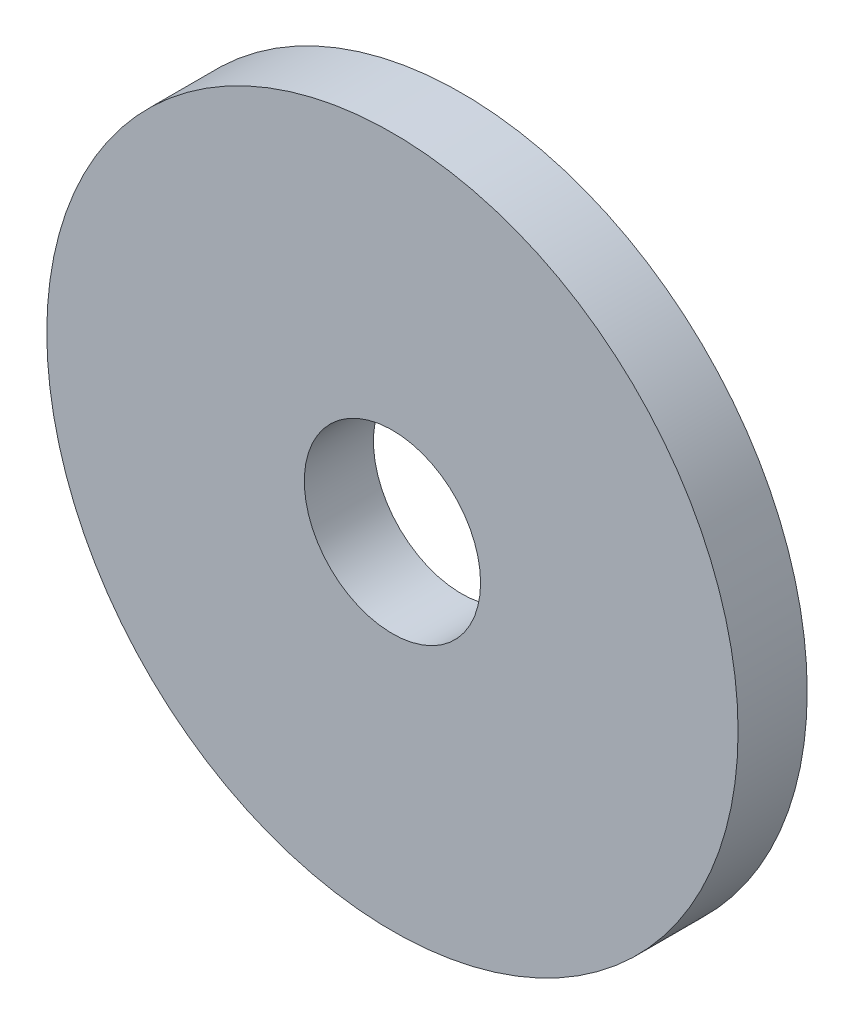
ISO-10303-21;
HEADER;
FILE_DESCRIPTION(('STEP AP214'),'2;1');
FILE_NAME('part.step','',(''),(''),'','','');
FILE_SCHEMA(('AUTOMOTIVE_DESIGN { 1 0 10303 214 1 1 1 1 }'));
ENDSEC;
DATA;
#1=APPLICATION_CONTEXT('core data for automotive mechanical design processes');
#2=APPLICATION_PROTOCOL_DEFINITION('international standard','automotive_design',2000,#1);
#3=PRODUCT_CONTEXT('',#1,'mechanical');
#4=PRODUCT('Part','Part','',(#3));
#5=PRODUCT_RELATED_PRODUCT_CATEGORY('part','',(#4));
#6=PRODUCT_DEFINITION_FORMATION('','',#4);
#7=PRODUCT_DEFINITION_CONTEXT('part definition',#1,'design');
#8=PRODUCT_DEFINITION('design','',#6,#7);
#9=PRODUCT_DEFINITION_SHAPE('','',#8);
#10=(LENGTH_UNIT() NAMED_UNIT(*) SI_UNIT(.MILLI.,.METRE.));
#11=(NAMED_UNIT(*) PLANE_ANGLE_UNIT() SI_UNIT($,.RADIAN.));
#12=(NAMED_UNIT(*) SI_UNIT($,.STERADIAN.) SOLID_ANGLE_UNIT());
#13=UNCERTAINTY_MEASURE_WITH_UNIT(LENGTH_MEASURE(1.E-05),#10,'distance_accuracy_value','');
#14=(GEOMETRIC_REPRESENTATION_CONTEXT(3) GLOBAL_UNCERTAINTY_ASSIGNED_CONTEXT((#13)) GLOBAL_UNIT_ASSIGNED_CONTEXT((#10,
#11,#12)) REPRESENTATION_CONTEXT('',''));
#15=CARTESIAN_POINT('',(0.,0.,0.));
#16=DIRECTION('',(0.,0.,1.));
#17=DIRECTION('',(1.,0.,0.));
#18=AXIS2_PLACEMENT_3D('',#15,#16,#17);
#19=CARTESIAN_POINT('',(0.,0.,2.));
#20=DIRECTION('',(0.,0.,1.));
#21=DIRECTION('',(1.,0.,0.));
#22=AXIS2_PLACEMENT_3D('',#19,#20,#21);
#23=PLANE('',#22);
#24=CARTESIAN_POINT('',(0.,0.,2.));
#25=DIRECTION('',(0.,0.,1.));
#26=DIRECTION('',(1.,0.,0.));
#27=AXIS2_PLACEMENT_3D('',#24,#25,#26);
#28=CIRCLE('',#27,10.);
#29=CARTESIAN_POINT('',(10.,0.,2.));
#30=VERTEX_POINT('',#29);
#31=EDGE_CURVE('E10',#30,#30,#28,.T.);
#32=ORIENTED_EDGE('',*,*,#31,.T.);
#33=EDGE_LOOP('',(#32));
#34=FACE_BOUND('',#33,.T.);
#35=CARTESIAN_POINT('',(0.,0.,2.));
#36=DIRECTION('',(0.,0.,1.));
#37=DIRECTION('',(1.,0.,0.));
#38=AXIS2_PLACEMENT_3D('',#35,#36,#37);
#39=CIRCLE('',#38,2.55);
#40=CARTESIAN_POINT('',(2.55,0.,2.));
#41=VERTEX_POINT('',#40);
#42=EDGE_CURVE('E42',#41,#41,#39,.T.);
#43=ORIENTED_EDGE('',*,*,#42,.F.);
#44=EDGE_LOOP('',(#43));
#45=FACE_BOUND('',#44,.T.);
#46=ADVANCED_FACE('F31',(#34,#45),#23,.T.);
#47=CARTESIAN_POINT('',(0.,0.,0.));
#48=DIRECTION('',(0.,0.,1.));
#49=DIRECTION('',(1.,0.,0.));
#50=AXIS2_PLACEMENT_3D('',#47,#48,#49);
#51=PLANE('',#50);
#52=CARTESIAN_POINT('',(0.,0.,0.));
#53=DIRECTION('',(0.,0.,1.));
#54=DIRECTION('',(1.,0.,0.));
#55=AXIS2_PLACEMENT_3D('',#52,#53,#54);
#56=CIRCLE('',#55,10.);
#57=CARTESIAN_POINT('',(10.,0.,0.));
#58=VERTEX_POINT('',#57);
#59=EDGE_CURVE('E35',#58,#58,#56,.T.);
#60=ORIENTED_EDGE('',*,*,#59,.F.);
#61=EDGE_LOOP('',(#60));
#62=FACE_BOUND('',#61,.T.);
#63=CARTESIAN_POINT('',(0.,0.,0.));
#64=DIRECTION('',(0.,0.,1.));
#65=DIRECTION('',(1.,0.,0.));
#66=AXIS2_PLACEMENT_3D('',#63,#64,#65);
#67=CIRCLE('',#66,2.55);
#68=CARTESIAN_POINT('',(2.55,0.,0.));
#69=VERTEX_POINT('',#68);
#70=EDGE_CURVE('E44',#69,#69,#67,.T.);
#71=ORIENTED_EDGE('',*,*,#70,.T.);
#72=EDGE_LOOP('',(#71));
#73=FACE_BOUND('',#72,.T.);
#74=ADVANCED_FACE('F54',(#62,#73),#51,.F.);
#75=CARTESIAN_POINT('',(0.,0.,2.));
#76=DIRECTION('',(0.,0.,-1.));
#77=DIRECTION('',(-1.,0.,0.));
#78=AXIS2_PLACEMENT_3D('',#75,#76,#77);
#79=CYLINDRICAL_SURFACE('',#78,10.);
#80=ORIENTED_EDGE('',*,*,#31,.F.);
#81=EDGE_LOOP('',(#80));
#82=FACE_BOUND('',#81,.T.);
#83=ORIENTED_EDGE('',*,*,#59,.T.);
#84=EDGE_LOOP('',(#83));
#85=FACE_BOUND('',#84,.T.);
#86=ADVANCED_FACE('F33',(#82,#85),#79,.T.);
#87=CARTESIAN_POINT('',(0.,0.,2.));
#88=DIRECTION('',(0.,0.,-1.));
#89=DIRECTION('',(-1.,0.,0.));
#90=AXIS2_PLACEMENT_3D('',#87,#88,#89);
#91=CYLINDRICAL_SURFACE('',#90,2.55);
#92=ORIENTED_EDGE('',*,*,#42,.T.);
#93=EDGE_LOOP('',(#92));
#94=FACE_BOUND('',#93,.T.);
#95=ORIENTED_EDGE('',*,*,#70,.F.);
#96=EDGE_LOOP('',(#95));
#97=FACE_BOUND('',#96,.T.);
#98=ADVANCED_FACE('F50',(#94,#97),#91,.F.);
#99=CLOSED_SHELL('',(#46,#74,#86,#98));
#100=MANIFOLD_SOLID_BREP('B2',#99);
#101=ADVANCED_BREP_SHAPE_REPRESENTATION('',(#18,#100),#14);
#102=SHAPE_DEFINITION_REPRESENTATION(#9,#101);
ENDSEC;
END-ISO-10303-21;
